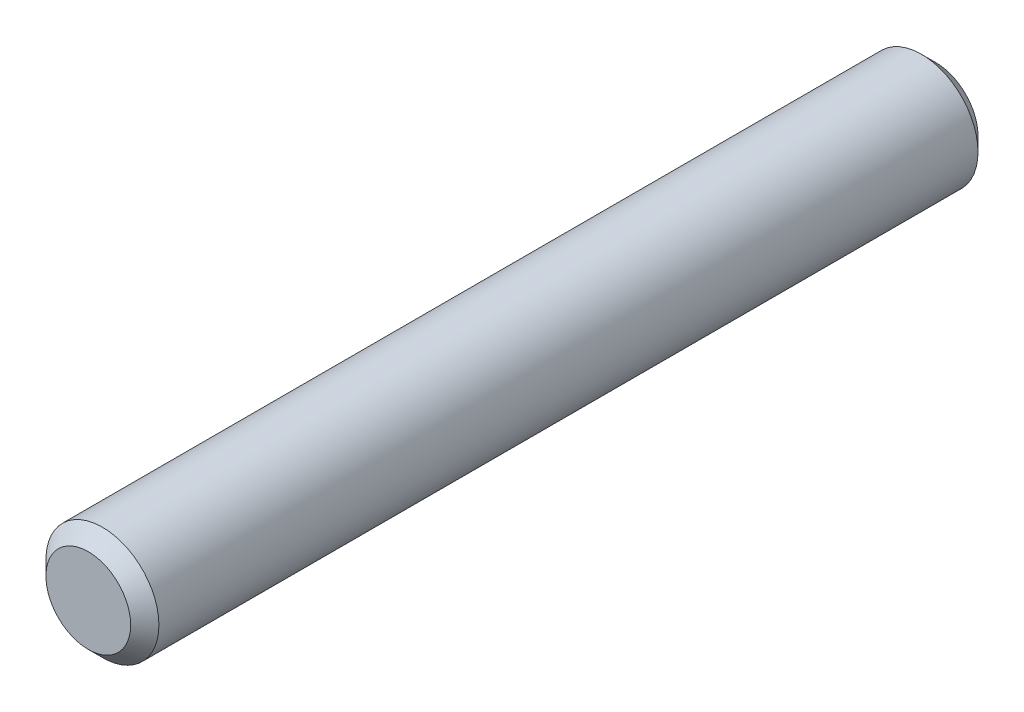
ISO-10303-21;
HEADER;
FILE_DESCRIPTION(('STEP AP214'),'2;1');
FILE_NAME('part.step','',(''),(''),'','','');
FILE_SCHEMA(('AUTOMOTIVE_DESIGN { 1 0 10303 214 1 1 1 1 }'));
ENDSEC;
DATA;
#1=APPLICATION_CONTEXT('core data for automotive mechanical design processes');
#2=APPLICATION_PROTOCOL_DEFINITION('international standard','automotive_design',2000,#1);
#3=PRODUCT_CONTEXT('',#1,'mechanical');
#4=PRODUCT('Part','Part','',(#3));
#5=PRODUCT_RELATED_PRODUCT_CATEGORY('part','',(#4));
#6=PRODUCT_DEFINITION_FORMATION('','',#4);
#7=PRODUCT_DEFINITION_CONTEXT('part definition',#1,'design');
#8=PRODUCT_DEFINITION('design','',#6,#7);
#9=PRODUCT_DEFINITION_SHAPE('','',#8);
#10=(LENGTH_UNIT() NAMED_UNIT(*) SI_UNIT(.MILLI.,.METRE.));
#11=(NAMED_UNIT(*) PLANE_ANGLE_UNIT() SI_UNIT($,.RADIAN.));
#12=(NAMED_UNIT(*) SI_UNIT($,.STERADIAN.) SOLID_ANGLE_UNIT());
#13=UNCERTAINTY_MEASURE_WITH_UNIT(LENGTH_MEASURE(1.E-05),#10,'distance_accuracy_value','');
#14=(GEOMETRIC_REPRESENTATION_CONTEXT(3) GLOBAL_UNCERTAINTY_ASSIGNED_CONTEXT((#13)) GLOBAL_UNIT_ASSIGNED_CONTEXT((#10,
#11,#12)) REPRESENTATION_CONTEXT('',''));
#15=CARTESIAN_POINT('',(0.,0.,0.));
#16=DIRECTION('',(0.,0.,1.));
#17=DIRECTION('',(1.,0.,0.));
#18=AXIS2_PLACEMENT_3D('',#15,#16,#17);
#19=CARTESIAN_POINT('',(0.,0.,-30.));
#20=DIRECTION('',(0.,0.,1.));
#21=DIRECTION('',(1.,0.,0.));
#22=AXIS2_PLACEMENT_3D('',#19,#20,#21);
#23=CYLINDRICAL_SURFACE('',#22,2.);
#24=CARTESIAN_POINT('',(0.,0.,-29.5));
#25=DIRECTION('',(0.,0.,1.));
#26=DIRECTION('',(1.,0.,0.));
#27=AXIS2_PLACEMENT_3D('',#24,#25,#26);
#28=CIRCLE('',#27,2.);
#29=CARTESIAN_POINT('',(2.,0.,-29.5));
#30=VERTEX_POINT('',#29);
#31=EDGE_CURVE('E43',#30,#30,#28,.T.);
#32=ORIENTED_EDGE('',*,*,#31,.T.);
#33=EDGE_LOOP('',(#32));
#34=FACE_BOUND('',#33,.T.);
#35=CARTESIAN_POINT('',(0.,0.,-0.499999999999997));
#36=DIRECTION('',(0.,0.,1.));
#37=DIRECTION('',(1.,0.,0.));
#38=AXIS2_PLACEMENT_3D('',#35,#36,#37);
#39=CIRCLE('',#38,2.);
#40=CARTESIAN_POINT('',(2.,0.,-0.499999999999997));
#41=VERTEX_POINT('',#40);
#42=EDGE_CURVE('E47',#41,#41,#39,.F.);
#43=ORIENTED_EDGE('',*,*,#42,.T.);
#44=EDGE_LOOP('',(#43));
#45=FACE_BOUND('',#44,.T.);
#46=ADVANCED_FACE('F32',(#34,#45),#23,.T.);
#47=CARTESIAN_POINT('',(0.,0.,-30.));
#48=DIRECTION('',(0.,0.,1.));
#49=DIRECTION('',(1.,0.,0.));
#50=AXIS2_PLACEMENT_3D('',#47,#48,#49);
#51=PLANE('',#50);
#52=CARTESIAN_POINT('',(0.,0.,-30.));
#53=DIRECTION('',(0.,0.,1.));
#54=DIRECTION('',(1.,0.,0.));
#55=AXIS2_PLACEMENT_3D('',#52,#53,#54);
#56=CIRCLE('',#55,1.49999999999999);
#57=CARTESIAN_POINT('',(1.49999999999999,0.,-30.));
#58=VERTEX_POINT('',#57);
#59=EDGE_CURVE('E39',#58,#58,#56,.F.);
#60=ORIENTED_EDGE('',*,*,#59,.T.);
#61=EDGE_LOOP('',(#60));
#62=FACE_BOUND('',#61,.T.);
#63=ADVANCED_FACE('F63',(#62),#51,.F.);
#64=CARTESIAN_POINT('',(0.,0.,0.));
#65=DIRECTION('',(0.,0.,1.));
#66=DIRECTION('',(1.,0.,0.));
#67=AXIS2_PLACEMENT_3D('',#64,#65,#66);
#68=PLANE('',#67);
#69=CARTESIAN_POINT('',(0.,0.,0.));
#70=DIRECTION('',(0.,0.,1.));
#71=DIRECTION('',(1.,0.,0.));
#72=AXIS2_PLACEMENT_3D('',#69,#70,#71);
#73=CIRCLE('',#72,1.5);
#74=CARTESIAN_POINT('',(1.5,0.,0.));
#75=VERTEX_POINT('',#74);
#76=EDGE_CURVE('E10',#75,#75,#73,.T.);
#77=ORIENTED_EDGE('',*,*,#76,.T.);
#78=EDGE_LOOP('',(#77));
#79=FACE_BOUND('',#78,.T.);
#80=ADVANCED_FACE('F60',(#79),#68,.T.);
#81=CARTESIAN_POINT('',(0.,0.,-29.5));
#82=DIRECTION('',(0.,0.,1.));
#83=DIRECTION('',(1.,0.,0.));
#84=AXIS2_PLACEMENT_3D('',#81,#82,#83);
#85=CONICAL_SURFACE('',#84,2.,0.78539816339746);
#86=ORIENTED_EDGE('',*,*,#59,.F.);
#87=EDGE_LOOP('',(#86));
#88=FACE_BOUND('',#87,.T.);
#89=ORIENTED_EDGE('',*,*,#31,.F.);
#90=EDGE_LOOP('',(#89));
#91=FACE_BOUND('',#90,.T.);
#92=ADVANCED_FACE('F56',(#88,#91),#85,.T.);
#93=CARTESIAN_POINT('',(0.,0.,0.));
#94=DIRECTION('',(0.,0.,-1.));
#95=DIRECTION('',(-1.,0.,0.));
#96=AXIS2_PLACEMENT_3D('',#93,#94,#95);
#97=CONICAL_SURFACE('',#96,1.5,0.78539816339745);
#98=ORIENTED_EDGE('',*,*,#42,.F.);
#99=EDGE_LOOP('',(#98));
#100=FACE_BOUND('',#99,.T.);
#101=ORIENTED_EDGE('',*,*,#76,.F.);
#102=EDGE_LOOP('',(#101));
#103=FACE_BOUND('',#102,.T.);
#104=ADVANCED_FACE('F34',(#100,#103),#97,.T.);
#105=CLOSED_SHELL('',(#46,#63,#80,#92,#104));
#106=MANIFOLD_SOLID_BREP('B2',#105);
#107=ADVANCED_BREP_SHAPE_REPRESENTATION('',(#18,#106),#14);
#108=SHAPE_DEFINITION_REPRESENTATION(#9,#107);
ENDSEC;
END-ISO-10303-21;
